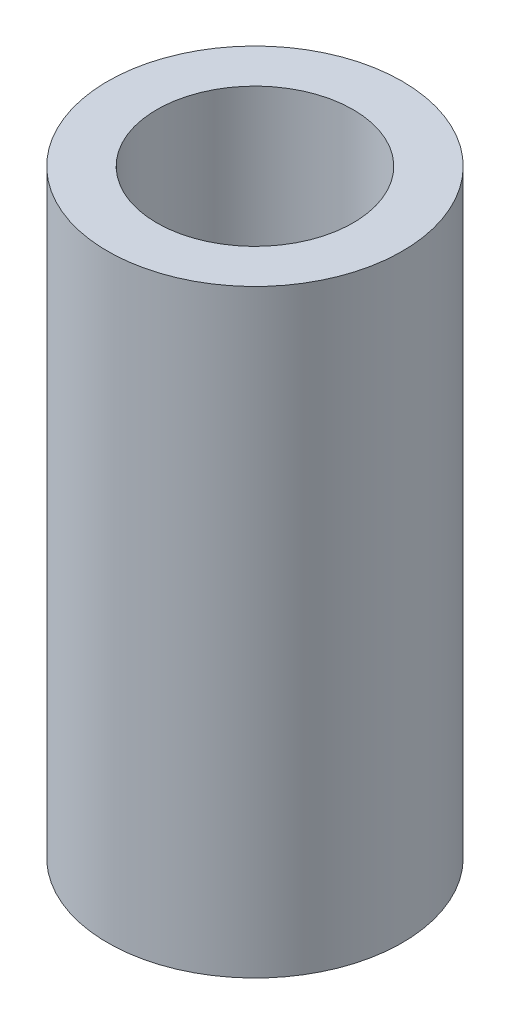
ISO-10303-21;
HEADER;
FILE_DESCRIPTION(('STEP AP214'),'2;1');
FILE_NAME('part.step','',(''),(''),'','','');
FILE_SCHEMA(('AUTOMOTIVE_DESIGN { 1 0 10303 214 1 1 1 1 }'));
ENDSEC;
DATA;
#1=APPLICATION_CONTEXT('core data for automotive mechanical design processes');
#2=APPLICATION_PROTOCOL_DEFINITION('international standard','automotive_design',2000,#1);
#3=PRODUCT_CONTEXT('',#1,'mechanical');
#4=PRODUCT('Part','Part','',(#3));
#5=PRODUCT_RELATED_PRODUCT_CATEGORY('part','',(#4));
#6=PRODUCT_DEFINITION_FORMATION('','',#4);
#7=PRODUCT_DEFINITION_CONTEXT('part definition',#1,'design');
#8=PRODUCT_DEFINITION('design','',#6,#7);
#9=PRODUCT_DEFINITION_SHAPE('','',#8);
#10=(LENGTH_UNIT() NAMED_UNIT(*) SI_UNIT(.MILLI.,.METRE.));
#11=(NAMED_UNIT(*) PLANE_ANGLE_UNIT() SI_UNIT($,.RADIAN.));
#12=(NAMED_UNIT(*) SI_UNIT($,.STERADIAN.) SOLID_ANGLE_UNIT());
#13=UNCERTAINTY_MEASURE_WITH_UNIT(LENGTH_MEASURE(1.E-05),#10,'distance_accuracy_value','');
#14=(GEOMETRIC_REPRESENTATION_CONTEXT(3) GLOBAL_UNCERTAINTY_ASSIGNED_CONTEXT((#13)) GLOBAL_UNIT_ASSIGNED_CONTEXT((#10,
#11,#12)) REPRESENTATION_CONTEXT('',''));
#15=CARTESIAN_POINT('',(0.,0.,0.));
#16=DIRECTION('',(0.,0.,1.));
#17=DIRECTION('',(1.,0.,0.));
#18=AXIS2_PLACEMENT_3D('',#15,#16,#17);
#19=CARTESIAN_POINT('',(0.,30.5,0.));
#20=DIRECTION('',(0.,1.,0.));
#21=DIRECTION('',(0.,0.,1.));
#22=AXIS2_PLACEMENT_3D('',#19,#20,#21);
#23=PLANE('',#22);
#24=CARTESIAN_POINT('',(0.,30.5,0.));
#25=DIRECTION('',(0.,1.,0.));
#26=DIRECTION('',(0.,0.,1.));
#27=AXIS2_PLACEMENT_3D('',#24,#25,#26);
#28=CIRCLE('',#27,7.5);
#29=CARTESIAN_POINT('',(0.,30.5,-7.5));
#30=VERTEX_POINT('',#29);
#31=EDGE_CURVE('E10',#30,#30,#28,.T.);
#32=ORIENTED_EDGE('',*,*,#31,.T.);
#33=EDGE_LOOP('',(#32));
#34=FACE_BOUND('',#33,.T.);
#35=CARTESIAN_POINT('',(0.,30.5,0.));
#36=DIRECTION('',(0.,1.,0.));
#37=DIRECTION('',(0.,0.,1.));
#38=AXIS2_PLACEMENT_3D('',#35,#36,#37);
#39=CIRCLE('',#38,5.);
#40=CARTESIAN_POINT('',(0.,30.5,-5.));
#41=VERTEX_POINT('',#40);
#42=EDGE_CURVE('E45',#41,#41,#39,.T.);
#43=ORIENTED_EDGE('',*,*,#42,.F.);
#44=EDGE_LOOP('',(#43));
#45=FACE_BOUND('',#44,.T.);
#46=ADVANCED_FACE('F34',(#34,#45),#23,.T.);
#47=CARTESIAN_POINT('',(0.,0.,0.));
#48=DIRECTION('',(0.,1.,0.));
#49=DIRECTION('',(0.,0.,1.));
#50=AXIS2_PLACEMENT_3D('',#47,#48,#49);
#51=PLANE('',#50);
#52=CARTESIAN_POINT('',(0.,0.,0.));
#53=DIRECTION('',(0.,1.,0.));
#54=DIRECTION('',(0.,0.,1.));
#55=AXIS2_PLACEMENT_3D('',#52,#53,#54);
#56=CIRCLE('',#55,7.5);
#57=CARTESIAN_POINT('',(0.,0.,-7.5));
#58=VERTEX_POINT('',#57);
#59=EDGE_CURVE('E38',#58,#58,#56,.T.);
#60=ORIENTED_EDGE('',*,*,#59,.F.);
#61=EDGE_LOOP('',(#60));
#62=FACE_BOUND('',#61,.T.);
#63=CARTESIAN_POINT('',(0.,0.,0.));
#64=DIRECTION('',(0.,1.,0.));
#65=DIRECTION('',(0.,0.,1.));
#66=AXIS2_PLACEMENT_3D('',#63,#64,#65);
#67=CIRCLE('',#66,5.);
#68=CARTESIAN_POINT('',(0.,0.,-5.));
#69=VERTEX_POINT('',#68);
#70=EDGE_CURVE('E47',#69,#69,#67,.T.);
#71=ORIENTED_EDGE('',*,*,#70,.T.);
#72=EDGE_LOOP('',(#71));
#73=FACE_BOUND('',#72,.T.);
#74=ADVANCED_FACE('F57',(#62,#73),#51,.F.);
#75=CARTESIAN_POINT('',(0.,30.5,0.));
#76=DIRECTION('',(0.,-1.,0.));
#77=DIRECTION('',(0.,0.,-1.));
#78=AXIS2_PLACEMENT_3D('',#75,#76,#77);
#79=CYLINDRICAL_SURFACE('',#78,7.5);
#80=CARTESIAN_POINT('',(0.,30.5,-7.5));
#81=CARTESIAN_POINT('',(0.,30.1822916666667,-7.5));
#82=CARTESIAN_POINT('',(0.,29.8645833333333,-7.5));
#83=CARTESIAN_POINT('',(0.,29.2291666666667,-7.5));
#84=CARTESIAN_POINT('',(0.,28.9114583333333,-7.5));
#85=CARTESIAN_POINT('',(0.,28.2760416666667,-7.5));
#86=CARTESIAN_POINT('',(0.,27.9583333333333,-7.5));
#87=CARTESIAN_POINT('',(0.,27.3229166666667,-7.5));
#88=CARTESIAN_POINT('',(0.,27.0052083333333,-7.5));
#89=CARTESIAN_POINT('',(0.,26.3697916666667,-7.5));
#90=CARTESIAN_POINT('',(0.,26.0520833333333,-7.5));
#91=CARTESIAN_POINT('',(0.,25.4166666666667,-7.5));
#92=CARTESIAN_POINT('',(0.,25.0989583333333,-7.5));
#93=CARTESIAN_POINT('',(0.,24.4635416666667,-7.5));
#94=CARTESIAN_POINT('',(0.,24.1458333333333,-7.5));
#95=CARTESIAN_POINT('',(0.,23.5104166666667,-7.5));
#96=CARTESIAN_POINT('',(0.,23.1927083333333,-7.5));
#97=CARTESIAN_POINT('',(0.,22.5572916666667,-7.5));
#98=CARTESIAN_POINT('',(0.,22.2395833333333,-7.5));
#99=CARTESIAN_POINT('',(0.,21.6041666666667,-7.5));
#100=CARTESIAN_POINT('',(0.,21.2864583333333,-7.5));
#101=CARTESIAN_POINT('',(0.,20.6510416666667,-7.5));
#102=CARTESIAN_POINT('',(0.,20.3333333333333,-7.5));
#103=CARTESIAN_POINT('',(0.,19.6979166666667,-7.5));
#104=CARTESIAN_POINT('',(0.,19.3802083333333,-7.5));
#105=CARTESIAN_POINT('',(0.,18.7447916666667,-7.5));
#106=CARTESIAN_POINT('',(0.,18.4270833333333,-7.5));
#107=CARTESIAN_POINT('',(0.,17.7916666666667,-7.5));
#108=CARTESIAN_POINT('',(0.,17.4739583333333,-7.5));
#109=CARTESIAN_POINT('',(0.,16.8385416666667,-7.5));
#110=CARTESIAN_POINT('',(0.,16.5208333333333,-7.5));
#111=CARTESIAN_POINT('',(0.,15.8854166666667,-7.5));
#112=CARTESIAN_POINT('',(0.,15.5677083333333,-7.5));
#113=CARTESIAN_POINT('',(0.,14.9322916666667,-7.5));
#114=CARTESIAN_POINT('',(0.,14.6145833333333,-7.5));
#115=CARTESIAN_POINT('',(0.,13.9791666666667,-7.5));
#116=CARTESIAN_POINT('',(0.,13.6614583333333,-7.5));
#117=CARTESIAN_POINT('',(0.,13.0260416666667,-7.5));
#118=CARTESIAN_POINT('',(0.,12.7083333333333,-7.5));
#119=CARTESIAN_POINT('',(0.,12.0729166666667,-7.5));
#120=CARTESIAN_POINT('',(0.,11.7552083333333,-7.5));
#121=CARTESIAN_POINT('',(0.,11.1197916666667,-7.5));
#122=CARTESIAN_POINT('',(0.,10.8020833333333,-7.5));
#123=CARTESIAN_POINT('',(0.,10.1666666666667,-7.5));
#124=CARTESIAN_POINT('',(0.,9.84895833333333,-7.5));
#125=CARTESIAN_POINT('',(0.,9.21354166666666,-7.5));
#126=CARTESIAN_POINT('',(0.,8.89583333333333,-7.5));
#127=CARTESIAN_POINT('',(0.,8.26041666666666,-7.5));
#128=CARTESIAN_POINT('',(0.,7.94270833333333,-7.5));
#129=CARTESIAN_POINT('',(0.,7.30729166666666,-7.5));
#130=CARTESIAN_POINT('',(0.,6.98958333333333,-7.5));
#131=CARTESIAN_POINT('',(0.,6.35416666666666,-7.5));
#132=CARTESIAN_POINT('',(0.,6.03645833333333,-7.5));
#133=CARTESIAN_POINT('',(0.,5.40104166666666,-7.5));
#134=CARTESIAN_POINT('',(0.,5.08333333333333,-7.5));
#135=CARTESIAN_POINT('',(0.,4.44791666666666,-7.5));
#136=CARTESIAN_POINT('',(0.,4.13020833333333,-7.5));
#137=CARTESIAN_POINT('',(0.,3.49479166666666,-7.5));
#138=CARTESIAN_POINT('',(0.,3.17708333333333,-7.5));
#139=CARTESIAN_POINT('',(0.,2.54166666666666,-7.5));
#140=CARTESIAN_POINT('',(0.,2.22395833333333,-7.5));
#141=CARTESIAN_POINT('',(0.,1.58854166666666,-7.5));
#142=CARTESIAN_POINT('',(0.,1.27083333333333,-7.5));
#143=CARTESIAN_POINT('',(0.,0.635416666666662,-7.5));
#144=CARTESIAN_POINT('',(0.,0.317708333333329,-7.5));
#145=CARTESIAN_POINT('',(0.,0.,-7.5));
#146=B_SPLINE_CURVE_WITH_KNOTS('',3,(#80,#81,#82,#83,#84,#85,#86,#87,#88,#89,#90,#91,#92,#93,
#94,#95,#96,#97,#98,#99,#100,#101,#102,#103,#104,#105,#106,#107,#108,#109,#110,#111,#112,#113,
#114,#115,#116,#117,#118,#119,#120,#121,#122,#123,#124,#125,#126,#127,#128,#129,#130,#131,#132,
#133,#134,#135,#136,#137,#138,#139,#140,#141,#142,#143,#144,#145),.UNSPECIFIED.,.F.,.F.,(4,2,2,
2,2,2,2,2,2,2,2,2,2,2,2,2,2,2,2,2,2,2,2,2,2,2,2,2,2,2,2,2,4),(0.,0.953124999999999,1.90625,
2.859375,3.8125,4.765625,5.71875,6.671875,7.625,8.57812499999999,9.53125,10.484375,11.4375,
12.390625,13.34375,14.296875,15.25,16.203125,17.15625,18.109375,19.0625,20.015625,20.96875,
21.921875,22.875,23.828125,24.78125,25.734375,26.6875,27.640625,28.59375,29.546875,30.5),.UNSPECIFIED.);
#147=EDGE_CURVE('BSEAM36',#30,#58,#146,.T.);
#148=ORIENTED_EDGE('',*,*,#31,.F.);
#149=ORIENTED_EDGE('',*,*,#59,.T.);
#150=ORIENTED_EDGE('',*,*,#147,.T.);
#151=ORIENTED_EDGE('',*,*,#147,.F.);
#152=EDGE_LOOP('',(#148,#150,#149,#151));
#153=FACE_BOUND('',#152,.T.);
#154=ADVANCED_FACE('F36',(#153),#79,.T.);
#155=CARTESIAN_POINT('',(0.,30.5,0.));
#156=DIRECTION('',(0.,-1.,0.));
#157=DIRECTION('',(0.,0.,-1.));
#158=AXIS2_PLACEMENT_3D('',#155,#156,#157);
#159=CYLINDRICAL_SURFACE('',#158,5.);
#160=CARTESIAN_POINT('',(0.,30.5,-5.));
#161=CARTESIAN_POINT('',(0.,30.1822916666667,-5.));
#162=CARTESIAN_POINT('',(0.,29.8645833333333,-5.));
#163=CARTESIAN_POINT('',(0.,29.2291666666667,-5.));
#164=CARTESIAN_POINT('',(0.,28.9114583333333,-5.));
#165=CARTESIAN_POINT('',(0.,28.2760416666667,-5.));
#166=CARTESIAN_POINT('',(0.,27.9583333333333,-5.));
#167=CARTESIAN_POINT('',(0.,27.3229166666667,-5.));
#168=CARTESIAN_POINT('',(0.,27.0052083333333,-5.));
#169=CARTESIAN_POINT('',(0.,26.3697916666667,-5.));
#170=CARTESIAN_POINT('',(0.,26.0520833333333,-5.));
#171=CARTESIAN_POINT('',(0.,25.4166666666667,-5.));
#172=CARTESIAN_POINT('',(0.,25.0989583333333,-5.));
#173=CARTESIAN_POINT('',(0.,24.4635416666667,-5.));
#174=CARTESIAN_POINT('',(0.,24.1458333333333,-5.));
#175=CARTESIAN_POINT('',(0.,23.5104166666667,-5.));
#176=CARTESIAN_POINT('',(0.,23.1927083333333,-5.));
#177=CARTESIAN_POINT('',(0.,22.5572916666667,-5.));
#178=CARTESIAN_POINT('',(0.,22.2395833333333,-5.));
#179=CARTESIAN_POINT('',(0.,21.6041666666667,-5.));
#180=CARTESIAN_POINT('',(0.,21.2864583333333,-5.));
#181=CARTESIAN_POINT('',(0.,20.6510416666667,-5.));
#182=CARTESIAN_POINT('',(0.,20.3333333333333,-5.));
#183=CARTESIAN_POINT('',(0.,19.6979166666667,-5.));
#184=CARTESIAN_POINT('',(0.,19.3802083333333,-5.));
#185=CARTESIAN_POINT('',(0.,18.7447916666667,-5.));
#186=CARTESIAN_POINT('',(0.,18.4270833333333,-5.));
#187=CARTESIAN_POINT('',(0.,17.7916666666667,-5.));
#188=CARTESIAN_POINT('',(0.,17.4739583333333,-5.));
#189=CARTESIAN_POINT('',(0.,16.8385416666667,-5.));
#190=CARTESIAN_POINT('',(0.,16.5208333333333,-5.));
#191=CARTESIAN_POINT('',(0.,15.8854166666667,-5.));
#192=CARTESIAN_POINT('',(0.,15.5677083333333,-5.));
#193=CARTESIAN_POINT('',(0.,14.9322916666667,-5.));
#194=CARTESIAN_POINT('',(0.,14.6145833333333,-5.));
#195=CARTESIAN_POINT('',(0.,13.9791666666667,-5.));
#196=CARTESIAN_POINT('',(0.,13.6614583333333,-5.));
#197=CARTESIAN_POINT('',(0.,13.0260416666667,-5.));
#198=CARTESIAN_POINT('',(0.,12.7083333333333,-5.));
#199=CARTESIAN_POINT('',(0.,12.0729166666667,-5.));
#200=CARTESIAN_POINT('',(0.,11.7552083333333,-5.));
#201=CARTESIAN_POINT('',(0.,11.1197916666667,-5.));
#202=CARTESIAN_POINT('',(0.,10.8020833333333,-5.));
#203=CARTESIAN_POINT('',(0.,10.1666666666667,-5.));
#204=CARTESIAN_POINT('',(0.,9.84895833333333,-5.));
#205=CARTESIAN_POINT('',(0.,9.21354166666666,-5.));
#206=CARTESIAN_POINT('',(0.,8.89583333333333,-5.));
#207=CARTESIAN_POINT('',(0.,8.26041666666666,-5.));
#208=CARTESIAN_POINT('',(0.,7.94270833333333,-5.));
#209=CARTESIAN_POINT('',(0.,7.30729166666666,-5.));
#210=CARTESIAN_POINT('',(0.,6.98958333333333,-5.));
#211=CARTESIAN_POINT('',(0.,6.35416666666666,-5.));
#212=CARTESIAN_POINT('',(0.,6.03645833333333,-5.));
#213=CARTESIAN_POINT('',(0.,5.40104166666667,-5.));
#214=CARTESIAN_POINT('',(0.,5.08333333333333,-5.));
#215=CARTESIAN_POINT('',(0.,4.44791666666667,-5.));
#216=CARTESIAN_POINT('',(0.,4.13020833333333,-5.));
#217=CARTESIAN_POINT('',(0.,3.49479166666666,-5.));
#218=CARTESIAN_POINT('',(0.,3.17708333333333,-5.));
#219=CARTESIAN_POINT('',(0.,2.54166666666666,-5.));
#220=CARTESIAN_POINT('',(0.,2.22395833333333,-5.));
#221=CARTESIAN_POINT('',(0.,1.58854166666666,-5.));
#222=CARTESIAN_POINT('',(0.,1.27083333333333,-5.));
#223=CARTESIAN_POINT('',(0.,0.635416666666662,-5.));
#224=CARTESIAN_POINT('',(0.,0.317708333333329,-5.));
#225=CARTESIAN_POINT('',(0.,0.,-5.));
#226=B_SPLINE_CURVE_WITH_KNOTS('',3,(#160,#161,#162,#163,#164,#165,#166,#167,#168,#169,#170,
#171,#172,#173,#174,#175,#176,#177,#178,#179,#180,#181,#182,#183,#184,#185,#186,#187,#188,#189,
#190,#191,#192,#193,#194,#195,#196,#197,#198,#199,#200,#201,#202,#203,#204,#205,#206,#207,#208,
#209,#210,#211,#212,#213,#214,#215,#216,#217,#218,#219,#220,#221,#222,#223,#224,#225),
.UNSPECIFIED.,.F.,.F.,(4,2,2,2,2,2,2,2,2,2,2,2,2,2,2,2,2,2,2,2,2,2,2,2,2,2,2,2,2,2,2,2,4),(0.,
0.953125000000003,1.90625,2.859375,3.8125,4.765625,5.71875,6.671875,7.625,8.578125,9.53125,
10.484375,11.4375,12.390625,13.34375,14.296875,15.25,16.203125,17.15625,18.109375,19.0625,
20.015625,20.96875,21.921875,22.875,23.828125,24.78125,25.734375,26.6875,27.640625,28.59375,
29.546875,30.5),.UNSPECIFIED.);
#227=EDGE_CURVE('BSEAM53',#41,#69,#226,.T.);
#228=ORIENTED_EDGE('',*,*,#42,.T.);
#229=ORIENTED_EDGE('',*,*,#70,.F.);
#230=ORIENTED_EDGE('',*,*,#227,.T.);
#231=ORIENTED_EDGE('',*,*,#227,.F.);
#232=EDGE_LOOP('',(#228,#230,#229,#231));
#233=FACE_BOUND('',#232,.T.);
#234=ADVANCED_FACE('F53',(#233),#159,.F.);
#235=CLOSED_SHELL('',(#46,#74,#154,#234));
#236=MANIFOLD_SOLID_BREP('B2',#235);
#237=ADVANCED_BREP_SHAPE_REPRESENTATION('',(#18,#236),#14);
#238=SHAPE_DEFINITION_REPRESENTATION(#9,#237);
ENDSEC;
END-ISO-10303-21;
